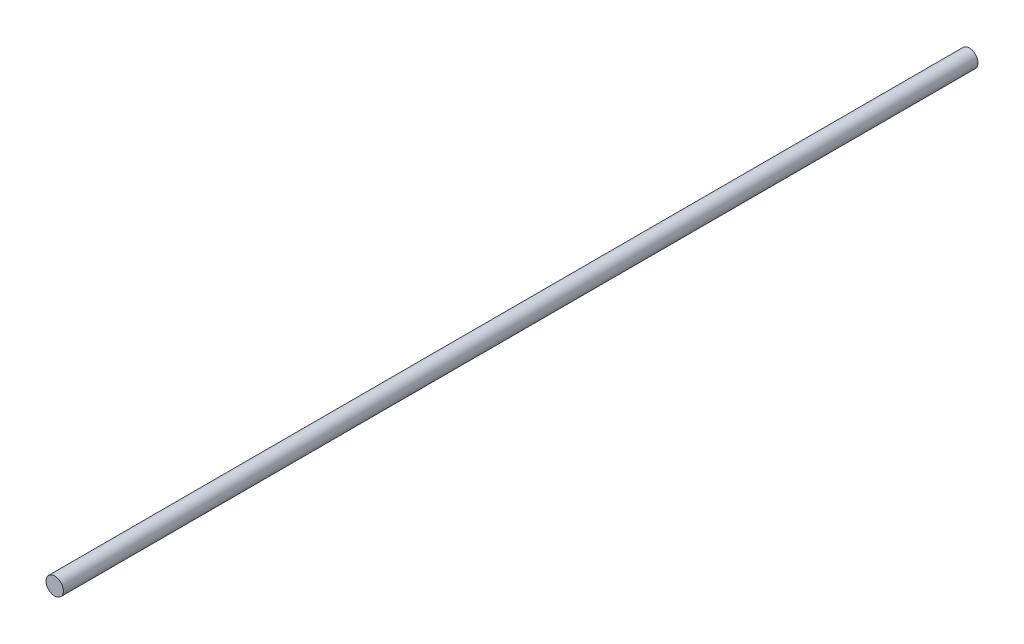
ISO-10303-21;
HEADER;
FILE_DESCRIPTION(('STEP AP214'),'2;1');
FILE_NAME('part.step','',(''),(''),'','','');
FILE_SCHEMA(('AUTOMOTIVE_DESIGN { 1 0 10303 214 1 1 1 1 }'));
ENDSEC;
DATA;
#1=APPLICATION_CONTEXT('core data for automotive mechanical design processes');
#2=APPLICATION_PROTOCOL_DEFINITION('international standard','automotive_design',2000,#1);
#3=PRODUCT_CONTEXT('',#1,'mechanical');
#4=PRODUCT('Part','Part','',(#3));
#5=PRODUCT_RELATED_PRODUCT_CATEGORY('part','',(#4));
#6=PRODUCT_DEFINITION_FORMATION('','',#4);
#7=PRODUCT_DEFINITION_CONTEXT('part definition',#1,'design');
#8=PRODUCT_DEFINITION('design','',#6,#7);
#9=PRODUCT_DEFINITION_SHAPE('','',#8);
#10=(LENGTH_UNIT() NAMED_UNIT(*) SI_UNIT(.MILLI.,.METRE.));
#11=(NAMED_UNIT(*) PLANE_ANGLE_UNIT() SI_UNIT($,.RADIAN.));
#12=(NAMED_UNIT(*) SI_UNIT($,.STERADIAN.) SOLID_ANGLE_UNIT());
#13=UNCERTAINTY_MEASURE_WITH_UNIT(LENGTH_MEASURE(1.E-05),#10,'distance_accuracy_value','');
#14=(GEOMETRIC_REPRESENTATION_CONTEXT(3) GLOBAL_UNCERTAINTY_ASSIGNED_CONTEXT((#13)) GLOBAL_UNIT_ASSIGNED_CONTEXT((#10,
#11,#12)) REPRESENTATION_CONTEXT('',''));
#15=CARTESIAN_POINT('',(0.,0.,0.));
#16=DIRECTION('',(0.,0.,1.));
#17=DIRECTION('',(1.,0.,0.));
#18=AXIS2_PLACEMENT_3D('',#15,#16,#17);
#19=CARTESIAN_POINT('',(0.,0.,19.1000004740064));
#20=DIRECTION('',(0.,0.,-1.));
#21=DIRECTION('',(-1.,0.,0.));
#22=AXIS2_PLACEMENT_3D('',#19,#20,#21);
#23=PLANE('',#22);
#24=CARTESIAN_POINT('',(0.,0.,19.1000004740064));
#25=DIRECTION('',(0.,0.,1.));
#26=DIRECTION('',(1.,0.,0.));
#27=AXIS2_PLACEMENT_3D('',#24,#25,#26);
#28=CIRCLE('',#27,4.);
#29=CARTESIAN_POINT('',(4.,0.,19.1000004740064));
#30=VERTEX_POINT('',#29);
#31=EDGE_CURVE('E10',#30,#30,#28,.T.);
#32=ORIENTED_EDGE('',*,*,#31,.T.);
#33=EDGE_LOOP('',(#32));
#34=FACE_BOUND('',#33,.T.);
#35=ADVANCED_FACE('F32',(#34),#23,.F.);
#36=CARTESIAN_POINT('',(0.,0.,19.1000004740064));
#37=DIRECTION('',(0.,0.,1.));
#38=DIRECTION('',(1.,0.,0.));
#39=AXIS2_PLACEMENT_3D('',#36,#37,#38);
#40=CYLINDRICAL_SURFACE('',#39,4.);
#41=ORIENTED_EDGE('',*,*,#31,.F.);
#42=EDGE_LOOP('',(#41));
#43=FACE_BOUND('',#42,.T.);
#44=CARTESIAN_POINT('',(0.,0.,-401.300000474007));
#45=DIRECTION('',(0.,0.,1.));
#46=DIRECTION('',(1.,0.,0.));
#47=AXIS2_PLACEMENT_3D('',#44,#45,#46);
#48=CIRCLE('',#47,4.);
#49=CARTESIAN_POINT('',(4.,0.,-401.300000474007));
#50=VERTEX_POINT('',#49);
#51=EDGE_CURVE('E38',#50,#50,#48,.T.);
#52=ORIENTED_EDGE('',*,*,#51,.T.);
#53=EDGE_LOOP('',(#52));
#54=FACE_BOUND('',#53,.T.);
#55=ADVANCED_FACE('F44',(#43,#54),#40,.T.);
#56=CARTESIAN_POINT('',(0.,0.,-401.300000474007));
#57=DIRECTION('',(0.,0.,1.));
#58=DIRECTION('',(1.,0.,0.));
#59=AXIS2_PLACEMENT_3D('',#56,#57,#58);
#60=PLANE('',#59);
#61=ORIENTED_EDGE('',*,*,#51,.F.);
#62=EDGE_LOOP('',(#61));
#63=FACE_BOUND('',#62,.T.);
#64=ADVANCED_FACE('F46',(#63),#60,.F.);
#65=CLOSED_SHELL('',(#35,#55,#64));
#66=MANIFOLD_SOLID_BREP('B2',#65);
#67=ADVANCED_BREP_SHAPE_REPRESENTATION('',(#18,#66),#14);
#68=SHAPE_DEFINITION_REPRESENTATION(#9,#67);
ENDSEC;
END-ISO-10303-21;
